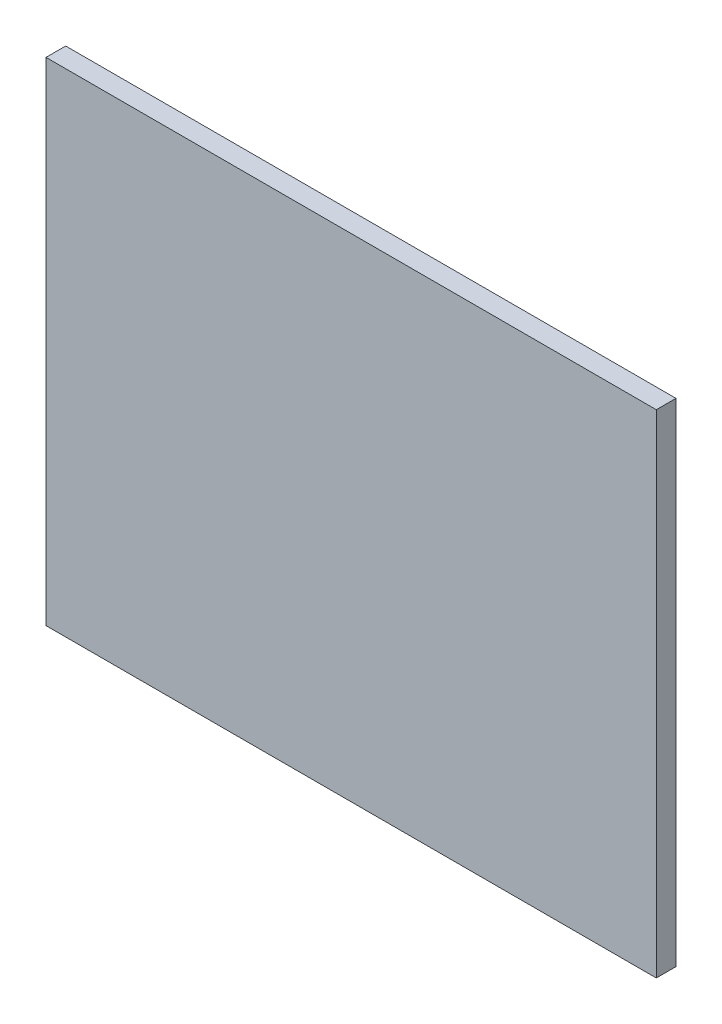
ISO-10303-21;
HEADER;
FILE_DESCRIPTION(('STEP AP214'),'2;1');
FILE_NAME('part.step','',(''),(''),'','','');
FILE_SCHEMA(('AUTOMOTIVE_DESIGN { 1 0 10303 214 1 1 1 1 }'));
ENDSEC;
DATA;
#1=APPLICATION_CONTEXT('core data for automotive mechanical design processes');
#2=APPLICATION_PROTOCOL_DEFINITION('international standard','automotive_design',2000,#1);
#3=PRODUCT_CONTEXT('',#1,'mechanical');
#4=PRODUCT('Part','Part','',(#3));
#5=PRODUCT_RELATED_PRODUCT_CATEGORY('part','',(#4));
#6=PRODUCT_DEFINITION_FORMATION('','',#4);
#7=PRODUCT_DEFINITION_CONTEXT('part definition',#1,'design');
#8=PRODUCT_DEFINITION('design','',#6,#7);
#9=PRODUCT_DEFINITION_SHAPE('','',#8);
#10=(LENGTH_UNIT() NAMED_UNIT(*) SI_UNIT(.MILLI.,.METRE.));
#11=(NAMED_UNIT(*) PLANE_ANGLE_UNIT() SI_UNIT($,.RADIAN.));
#12=(NAMED_UNIT(*) SI_UNIT($,.STERADIAN.) SOLID_ANGLE_UNIT());
#13=UNCERTAINTY_MEASURE_WITH_UNIT(LENGTH_MEASURE(1.E-05),#10,'distance_accuracy_value','');
#14=(GEOMETRIC_REPRESENTATION_CONTEXT(3) GLOBAL_UNCERTAINTY_ASSIGNED_CONTEXT((#13)) GLOBAL_UNIT_ASSIGNED_CONTEXT((#10,
#11,#12)) REPRESENTATION_CONTEXT('',''));
#15=CARTESIAN_POINT('',(0.,0.,0.));
#16=DIRECTION('',(0.,0.,1.));
#17=DIRECTION('',(1.,0.,0.));
#18=AXIS2_PLACEMENT_3D('',#15,#16,#17);
#19=CARTESIAN_POINT('',(0.,0.,5.));
#20=DIRECTION('',(1.,0.,0.));
#21=DIRECTION('',(0.,0.,-1.));
#22=AXIS2_PLACEMENT_3D('',#19,#20,#21);
#23=PLANE('',#22);
#24=DIRECTION('',(0.,-1.,0.));
#25=VECTOR('',#24,1.);
#26=CARTESIAN_POINT('',(0.,0.,0.));
#27=LINE('',#26,#25);
#28=CARTESIAN_POINT('',(0.,125.,0.));
#29=VERTEX_POINT('',#28);
#30=CARTESIAN_POINT('',(0.,0.,0.));
#31=VERTEX_POINT('',#30);
#32=EDGE_CURVE('E98',#29,#31,#27,.T.);
#33=ORIENTED_EDGE('',*,*,#32,.T.);
#34=DIRECTION('',(0.,0.,-1.));
#35=VECTOR('',#34,1.);
#36=CARTESIAN_POINT('',(0.,0.,5.));
#37=LINE('',#36,#35);
#38=CARTESIAN_POINT('',(0.,0.,5.));
#39=VERTEX_POINT('',#38);
#40=EDGE_CURVE('E11',#39,#31,#37,.T.);
#41=ORIENTED_EDGE('',*,*,#40,.F.);
#42=DIRECTION('',(0.,-1.,0.));
#43=VECTOR('',#42,1.);
#44=CARTESIAN_POINT('',(0.,0.,5.));
#45=LINE('',#44,#43);
#46=CARTESIAN_POINT('',(0.,125.,5.));
#47=VERTEX_POINT('',#46);
#48=EDGE_CURVE('E86',#47,#39,#45,.T.);
#49=ORIENTED_EDGE('',*,*,#48,.F.);
#50=DIRECTION('',(0.,0.,-1.));
#51=VECTOR('',#50,1.);
#52=CARTESIAN_POINT('',(0.,125.,5.));
#53=LINE('',#52,#51);
#54=EDGE_CURVE('E94',#47,#29,#53,.T.);
#55=ORIENTED_EDGE('',*,*,#54,.T.);
#56=EDGE_LOOP('',(#33,#41,#49,#55));
#57=FACE_BOUND('',#56,.T.);
#58=ADVANCED_FACE('F35',(#57),#23,.F.);
#59=CARTESIAN_POINT('',(0.,0.,5.));
#60=DIRECTION('',(0.,1.,0.));
#61=DIRECTION('',(0.,0.,1.));
#62=AXIS2_PLACEMENT_3D('',#59,#60,#61);
#63=PLANE('',#62);
#64=DIRECTION('',(1.,0.,0.));
#65=VECTOR('',#64,1.);
#66=CARTESIAN_POINT('',(0.,0.,0.));
#67=LINE('',#66,#65);
#68=CARTESIAN_POINT('',(155.,0.,0.));
#69=VERTEX_POINT('',#68);
#70=EDGE_CURVE('E90',#31,#69,#67,.T.);
#71=ORIENTED_EDGE('',*,*,#70,.T.);
#72=DIRECTION('',(0.,0.,-1.));
#73=VECTOR('',#72,1.);
#74=CARTESIAN_POINT('',(155.,0.,5.));
#75=LINE('',#74,#73);
#76=CARTESIAN_POINT('',(155.,0.,5.));
#77=VERTEX_POINT('',#76);
#78=EDGE_CURVE('E43',#77,#69,#75,.T.);
#79=ORIENTED_EDGE('',*,*,#78,.F.);
#80=DIRECTION('',(1.,0.,0.));
#81=VECTOR('',#80,1.);
#82=CARTESIAN_POINT('',(0.,0.,5.));
#83=LINE('',#82,#81);
#84=EDGE_CURVE('E81',#39,#77,#83,.T.);
#85=ORIENTED_EDGE('',*,*,#84,.F.);
#86=ORIENTED_EDGE('',*,*,#40,.T.);
#87=EDGE_LOOP('',(#71,#79,#85,#86));
#88=FACE_BOUND('',#87,.T.);
#89=ADVANCED_FACE('F89',(#88),#63,.F.);
#90=CARTESIAN_POINT('',(155.,0.,5.));
#91=DIRECTION('',(-1.,0.,0.));
#92=DIRECTION('',(0.,0.,1.));
#93=AXIS2_PLACEMENT_3D('',#90,#91,#92);
#94=PLANE('',#93);
#95=DIRECTION('',(0.,1.,0.));
#96=VECTOR('',#95,1.);
#97=CARTESIAN_POINT('',(155.,0.,0.));
#98=LINE('',#97,#96);
#99=CARTESIAN_POINT('',(155.,125.,0.));
#100=VERTEX_POINT('',#99);
#101=EDGE_CURVE('E68',#69,#100,#98,.T.);
#102=ORIENTED_EDGE('',*,*,#101,.T.);
#103=DIRECTION('',(0.,0.,-1.));
#104=VECTOR('',#103,1.);
#105=CARTESIAN_POINT('',(155.,125.,5.));
#106=LINE('',#105,#104);
#107=CARTESIAN_POINT('',(155.,125.,5.));
#108=VERTEX_POINT('',#107);
#109=EDGE_CURVE('E91',#108,#100,#106,.T.);
#110=ORIENTED_EDGE('',*,*,#109,.F.);
#111=DIRECTION('',(0.,1.,0.));
#112=VECTOR('',#111,1.);
#113=CARTESIAN_POINT('',(155.,0.,5.));
#114=LINE('',#113,#112);
#115=EDGE_CURVE('E84',#77,#108,#114,.T.);
#116=ORIENTED_EDGE('',*,*,#115,.F.);
#117=ORIENTED_EDGE('',*,*,#78,.T.);
#118=EDGE_LOOP('',(#102,#110,#116,#117));
#119=FACE_BOUND('',#118,.T.);
#120=ADVANCED_FACE('F92',(#119),#94,.F.);
#121=CARTESIAN_POINT('',(0.,125.,5.));
#122=DIRECTION('',(0.,-1.,0.));
#123=DIRECTION('',(0.,0.,-1.));
#124=AXIS2_PLACEMENT_3D('',#121,#122,#123);
#125=PLANE('',#124);
#126=DIRECTION('',(-1.,0.,0.));
#127=VECTOR('',#126,1.);
#128=CARTESIAN_POINT('',(0.,125.,0.));
#129=LINE('',#128,#127);
#130=EDGE_CURVE('E74',#100,#29,#129,.T.);
#131=ORIENTED_EDGE('',*,*,#130,.T.);
#132=ORIENTED_EDGE('',*,*,#54,.F.);
#133=DIRECTION('',(-1.,0.,0.));
#134=VECTOR('',#133,1.);
#135=CARTESIAN_POINT('',(0.,125.,5.));
#136=LINE('',#135,#134);
#137=EDGE_CURVE('E51',#108,#47,#136,.T.);
#138=ORIENTED_EDGE('',*,*,#137,.F.);
#139=ORIENTED_EDGE('',*,*,#109,.T.);
#140=EDGE_LOOP('',(#131,#132,#138,#139));
#141=FACE_BOUND('',#140,.T.);
#142=ADVANCED_FACE('F105',(#141),#125,.F.);
#143=CARTESIAN_POINT('',(0.,0.,5.));
#144=DIRECTION('',(0.,0.,-1.));
#145=DIRECTION('',(-1.,0.,0.));
#146=AXIS2_PLACEMENT_3D('',#143,#144,#145);
#147=PLANE('',#146);
#148=ORIENTED_EDGE('',*,*,#48,.T.);
#149=ORIENTED_EDGE('',*,*,#84,.T.);
#150=ORIENTED_EDGE('',*,*,#115,.T.);
#151=ORIENTED_EDGE('',*,*,#137,.T.);
#152=EDGE_LOOP('',(#148,#149,#150,#151));
#153=FACE_BOUND('',#152,.T.);
#154=ADVANCED_FACE('F82',(#153),#147,.F.);
#155=CARTESIAN_POINT('',(0.,0.,0.));
#156=DIRECTION('',(0.,0.,-1.));
#157=DIRECTION('',(-1.,0.,0.));
#158=AXIS2_PLACEMENT_3D('',#155,#156,#157);
#159=PLANE('',#158);
#160=ORIENTED_EDGE('',*,*,#32,.F.);
#161=ORIENTED_EDGE('',*,*,#130,.F.);
#162=ORIENTED_EDGE('',*,*,#101,.F.);
#163=ORIENTED_EDGE('',*,*,#70,.F.);
#164=EDGE_LOOP('',(#160,#161,#162,#163));
#165=FACE_BOUND('',#164,.T.);
#166=ADVANCED_FACE('F108',(#165),#159,.T.);
#167=CLOSED_SHELL('',(#58,#89,#120,#142,#154,#166));
#168=MANIFOLD_SOLID_BREP('B2',#167);
#169=ADVANCED_BREP_SHAPE_REPRESENTATION('',(#18,#168),#14);
#170=SHAPE_DEFINITION_REPRESENTATION(#9,#169);
ENDSEC;
END-ISO-10303-21;
